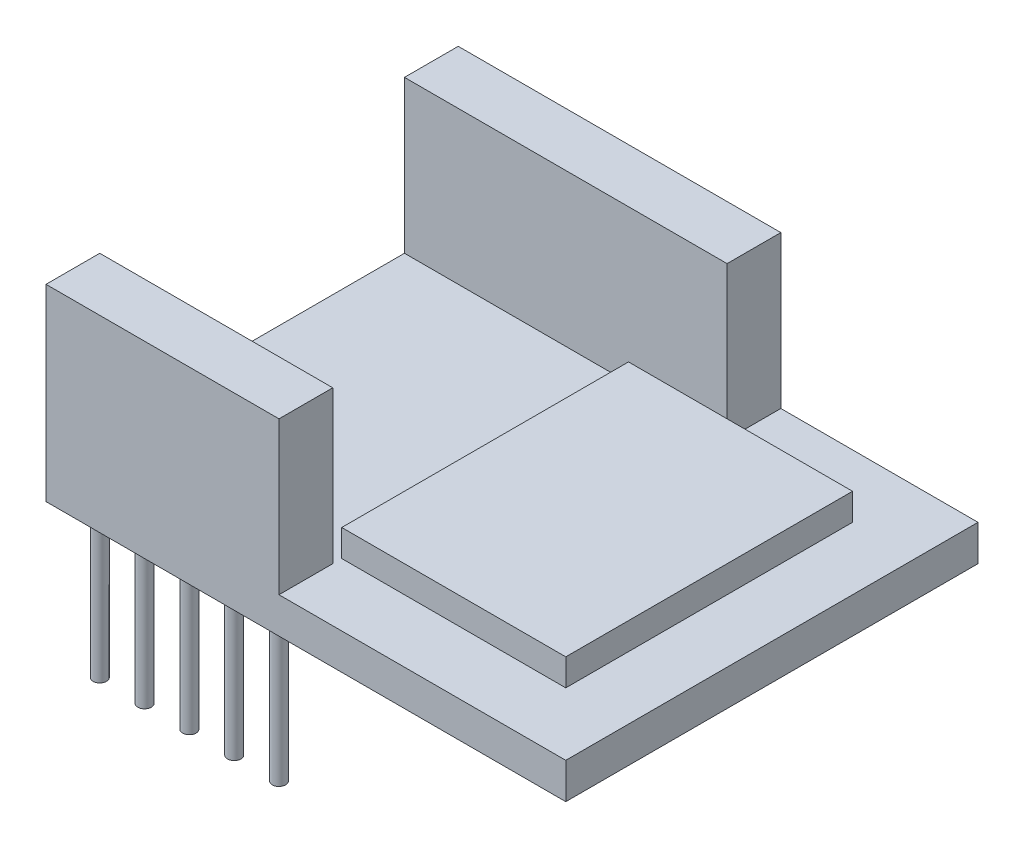
ISO-10303-21;
HEADER;
FILE_DESCRIPTION(('STEP AP214'),'2;1');
FILE_NAME('part.step','',(''),(''),'','','');
FILE_SCHEMA(('AUTOMOTIVE_DESIGN { 1 0 10303 214 1 1 1 1 }'));
ENDSEC;
DATA;
#1=APPLICATION_CONTEXT('core data for automotive mechanical design processes');
#2=APPLICATION_PROTOCOL_DEFINITION('international standard','automotive_design',2000,#1);
#3=PRODUCT_CONTEXT('',#1,'mechanical');
#4=PRODUCT('Part','Part','',(#3));
#5=PRODUCT_RELATED_PRODUCT_CATEGORY('part','',(#4));
#6=PRODUCT_DEFINITION_FORMATION('','',#4);
#7=PRODUCT_DEFINITION_CONTEXT('part definition',#1,'design');
#8=PRODUCT_DEFINITION('design','',#6,#7);
#9=PRODUCT_DEFINITION_SHAPE('','',#8);
#10=(LENGTH_UNIT() NAMED_UNIT(*) SI_UNIT(.MILLI.,.METRE.));
#11=(NAMED_UNIT(*) PLANE_ANGLE_UNIT() SI_UNIT($,.RADIAN.));
#12=(NAMED_UNIT(*) SI_UNIT($,.STERADIAN.) SOLID_ANGLE_UNIT());
#13=UNCERTAINTY_MEASURE_WITH_UNIT(LENGTH_MEASURE(1.E-05),#10,'distance_accuracy_value','');
#14=(GEOMETRIC_REPRESENTATION_CONTEXT(3) GLOBAL_UNCERTAINTY_ASSIGNED_CONTEXT((#13)) GLOBAL_UNIT_ASSIGNED_CONTEXT((#10,
#11,#12)) REPRESENTATION_CONTEXT('',''));
#15=CARTESIAN_POINT('',(0.,0.,0.));
#16=DIRECTION('',(0.,0.,1.));
#17=DIRECTION('',(1.,0.,0.));
#18=AXIS2_PLACEMENT_3D('',#15,#16,#17);
#19=CARTESIAN_POINT('',(0.,2.,0.));
#20=DIRECTION('',(0.,1.,0.));
#21=DIRECTION('',(0.,0.,1.));
#22=AXIS2_PLACEMENT_3D('',#19,#20,#21);
#23=PLANE('',#22);
#24=DIRECTION('',(0.,0.,-1.));
#25=VECTOR('',#24,1.);
#26=CARTESIAN_POINT('',(3.50000000000001,2.,-11.5));
#27=LINE('',#26,#25);
#28=CARTESIAN_POINT('',(3.50000000000002,2.,-8.49999999999999));
#29=VERTEX_POINT('',#28);
#30=CARTESIAN_POINT('',(3.50000000000001,2.,-11.5));
#31=VERTEX_POINT('',#30);
#32=EDGE_CURVE('E206',#29,#31,#27,.T.);
#33=ORIENTED_EDGE('',*,*,#32,.F.);
#34=DIRECTION('',(1.,0.,0.));
#35=VECTOR('',#34,1.);
#36=CARTESIAN_POINT('',(-14.5,2.,-8.49999999999999));
#37=LINE('',#36,#35);
#38=CARTESIAN_POINT('',(-14.5,2.,-8.49999999999999));
#39=VERTEX_POINT('',#38);
#40=EDGE_CURVE('E201',#39,#29,#37,.T.);
#41=ORIENTED_EDGE('',*,*,#40,.F.);
#42=DIRECTION('',(0.,0.,1.));
#43=VECTOR('',#42,1.);
#44=CARTESIAN_POINT('',(-14.5,2.,-11.5));
#45=LINE('',#44,#43);
#46=CARTESIAN_POINT('',(-14.5,2.,8.49999999999999));
#47=VERTEX_POINT('',#46);
#48=EDGE_CURVE('E246',#39,#47,#45,.T.);
#49=ORIENTED_EDGE('',*,*,#48,.T.);
#50=DIRECTION('',(-1.,0.,0.));
#51=VECTOR('',#50,1.);
#52=CARTESIAN_POINT('',(-14.5,2.,8.49999999999999));
#53=LINE('',#52,#51);
#54=CARTESIAN_POINT('',(-1.49999999999998,2.,8.49999999999999));
#55=VERTEX_POINT('',#54);
#56=EDGE_CURVE('E225',#55,#47,#53,.T.);
#57=ORIENTED_EDGE('',*,*,#56,.F.);
#58=DIRECTION('',(0.,0.,-1.));
#59=VECTOR('',#58,1.);
#60=CARTESIAN_POINT('',(-1.49999999999998,2.,11.5));
#61=LINE('',#60,#59);
#62=CARTESIAN_POINT('',(-1.49999999999998,2.,11.5));
#63=VERTEX_POINT('',#62);
#64=EDGE_CURVE('E220',#63,#55,#61,.T.);
#65=ORIENTED_EDGE('',*,*,#64,.F.);
#66=DIRECTION('',(1.,0.,0.));
#67=VECTOR('',#66,1.);
#68=CARTESIAN_POINT('',(-14.5,2.,11.5));
#69=LINE('',#68,#67);
#70=CARTESIAN_POINT('',(14.5,2.,11.5));
#71=VERTEX_POINT('',#70);
#72=EDGE_CURVE('E249',#63,#71,#69,.T.);
#73=ORIENTED_EDGE('',*,*,#72,.T.);
#74=DIRECTION('',(0.,0.,-1.));
#75=VECTOR('',#74,1.);
#76=CARTESIAN_POINT('',(14.5,2.,-11.5));
#77=LINE('',#76,#75);
#78=CARTESIAN_POINT('',(14.5,2.,-11.5));
#79=VERTEX_POINT('',#78);
#80=EDGE_CURVE('E302',#71,#79,#77,.T.);
#81=ORIENTED_EDGE('',*,*,#80,.T.);
#82=DIRECTION('',(-1.,0.,0.));
#83=VECTOR('',#82,1.);
#84=CARTESIAN_POINT('',(-14.5,2.,-11.5));
#85=LINE('',#84,#83);
#86=EDGE_CURVE('E250',#79,#31,#85,.T.);
#87=ORIENTED_EDGE('',*,*,#86,.T.);
#88=EDGE_LOOP('',(#33,#41,#49,#57,#65,#73,#81,#87));
#89=FACE_BOUND('',#88,.T.);
#90=DIRECTION('',(1.,0.,0.));
#91=VECTOR('',#90,1.);
#92=CARTESIAN_POINT('',(-1.49999999999998,2.,7.99999999999999));
#93=LINE('',#92,#91);
#94=CARTESIAN_POINT('',(-1.49999999999998,2.,7.99999999999999));
#95=VERTEX_POINT('',#94);
#96=CARTESIAN_POINT('',(11.,2.,7.99999999999999));
#97=VERTEX_POINT('',#96);
#98=EDGE_CURVE('E762',#95,#97,#93,.T.);
#99=ORIENTED_EDGE('',*,*,#98,.F.);
#100=DIRECTION('',(0.,0.,1.));
#101=VECTOR('',#100,1.);
#102=CARTESIAN_POINT('',(-1.49999999999998,2.,-8.00000000000001));
#103=LINE('',#102,#101);
#104=CARTESIAN_POINT('',(-1.49999999999998,2.,-8.00000000000001));
#105=VERTEX_POINT('',#104);
#106=EDGE_CURVE('E159',#105,#95,#103,.T.);
#107=ORIENTED_EDGE('',*,*,#106,.F.);
#108=DIRECTION('',(-1.,0.,0.));
#109=VECTOR('',#108,1.);
#110=CARTESIAN_POINT('',(11.,2.,-8.00000000000001));
#111=LINE('',#110,#109);
#112=CARTESIAN_POINT('',(11.,2.,-8.00000000000001));
#113=VERTEX_POINT('',#112);
#114=EDGE_CURVE('E155',#113,#105,#111,.T.);
#115=ORIENTED_EDGE('',*,*,#114,.F.);
#116=DIRECTION('',(0.,0.,-1.));
#117=VECTOR('',#116,1.);
#118=CARTESIAN_POINT('',(11.,2.,7.99999999999999));
#119=LINE('',#118,#117);
#120=EDGE_CURVE('E759',#97,#113,#119,.T.);
#121=ORIENTED_EDGE('',*,*,#120,.F.);
#122=EDGE_LOOP('',(#99,#107,#115,#121));
#123=FACE_BOUND('',#122,.T.);
#124=ADVANCED_FACE('F34',(#89,#123),#23,.T.);
#125=CARTESIAN_POINT('',(0.,0.,0.));
#126=DIRECTION('',(0.,1.,0.));
#127=DIRECTION('',(0.,0.,1.));
#128=AXIS2_PLACEMENT_3D('',#125,#126,#127);
#129=PLANE('',#128);
#130=CARTESIAN_POINT('',(-10.5,0.,-10.));
#131=DIRECTION('',(0.,1.,0.));
#132=DIRECTION('',(0.,0.,1.));
#133=AXIS2_PLACEMENT_3D('',#130,#131,#132);
#134=CIRCLE('',#133,0.374999999999999);
#135=CARTESIAN_POINT('',(-10.5,0.,-9.62500000000001));
#136=VERTEX_POINT('',#135);
#137=EDGE_CURVE('E42',#136,#136,#134,.F.);
#138=ORIENTED_EDGE('',*,*,#137,.F.);
#139=EDGE_LOOP('',(#138));
#140=FACE_BOUND('',#139,.T.);
#141=CARTESIAN_POINT('',(-10.5,0.,9.99999999999999));
#142=DIRECTION('',(0.,1.,0.));
#143=DIRECTION('',(0.,0.,1.));
#144=AXIS2_PLACEMENT_3D('',#141,#142,#143);
#145=CIRCLE('',#144,0.374999999999999);
#146=CARTESIAN_POINT('',(-10.5,0.,10.375));
#147=VERTEX_POINT('',#146);
#148=EDGE_CURVE('E341',#147,#147,#145,.F.);
#149=ORIENTED_EDGE('',*,*,#148,.F.);
#150=EDGE_LOOP('',(#149));
#151=FACE_BOUND('',#150,.T.);
#152=CARTESIAN_POINT('',(-5.49999999999999,0.,9.99999999999999));
#153=DIRECTION('',(0.,1.,0.));
#154=DIRECTION('',(0.,0.,1.));
#155=AXIS2_PLACEMENT_3D('',#152,#153,#154);
#156=CIRCLE('',#155,0.375000000000001);
#157=CARTESIAN_POINT('',(-5.49999999999999,0.,10.375));
#158=VERTEX_POINT('',#157);
#159=EDGE_CURVE('E335',#158,#158,#156,.F.);
#160=ORIENTED_EDGE('',*,*,#159,.F.);
#161=EDGE_LOOP('',(#160));
#162=FACE_BOUND('',#161,.T.);
#163=CARTESIAN_POINT('',(-7.99999999999999,0.,-10.));
#164=DIRECTION('',(0.,1.,0.));
#165=DIRECTION('',(0.,0.,1.));
#166=AXIS2_PLACEMENT_3D('',#163,#164,#165);
#167=CIRCLE('',#166,0.374999999999999);
#168=CARTESIAN_POINT('',(-7.99999999999999,0.,-9.62500000000001));
#169=VERTEX_POINT('',#168);
#170=EDGE_CURVE('E329',#169,#169,#167,.F.);
#171=ORIENTED_EDGE('',*,*,#170,.F.);
#172=EDGE_LOOP('',(#171));
#173=FACE_BOUND('',#172,.T.);
#174=CARTESIAN_POINT('',(-2.99999999999999,0.,-10.));
#175=DIRECTION('',(0.,1.,0.));
#176=DIRECTION('',(0.,0.,1.));
#177=AXIS2_PLACEMENT_3D('',#174,#175,#176);
#178=CIRCLE('',#177,0.375000000000001);
#179=CARTESIAN_POINT('',(-2.99999999999999,0.,-9.62500000000001));
#180=VERTEX_POINT('',#179);
#181=EDGE_CURVE('E320',#180,#180,#178,.F.);
#182=ORIENTED_EDGE('',*,*,#181,.F.);
#183=EDGE_LOOP('',(#182));
#184=FACE_BOUND('',#183,.T.);
#185=CARTESIAN_POINT('',(2.00000000000001,0.,-10.));
#186=DIRECTION('',(0.,1.,0.));
#187=DIRECTION('',(0.,0.,1.));
#188=AXIS2_PLACEMENT_3D('',#185,#186,#187);
#189=CIRCLE('',#188,0.375000000000001);
#190=CARTESIAN_POINT('',(2.00000000000001,0.,-9.62500000000001));
#191=VERTEX_POINT('',#190);
#192=EDGE_CURVE('E251',#191,#191,#189,.F.);
#193=ORIENTED_EDGE('',*,*,#192,.F.);
#194=EDGE_LOOP('',(#193));
#195=FACE_BOUND('',#194,.T.);
#196=DIRECTION('',(0.,0.,-1.));
#197=VECTOR('',#196,1.);
#198=CARTESIAN_POINT('',(14.5,0.,-11.5));
#199=LINE('',#198,#197);
#200=CARTESIAN_POINT('',(14.5,0.,11.5));
#201=VERTEX_POINT('',#200);
#202=CARTESIAN_POINT('',(14.5,0.,-11.5));
#203=VERTEX_POINT('',#202);
#204=EDGE_CURVE('E258',#201,#203,#199,.T.);
#205=ORIENTED_EDGE('',*,*,#204,.F.);
#206=DIRECTION('',(1.,0.,0.));
#207=VECTOR('',#206,1.);
#208=CARTESIAN_POINT('',(-14.5,0.,11.5));
#209=LINE('',#208,#207);
#210=CARTESIAN_POINT('',(-14.5,0.,11.5));
#211=VERTEX_POINT('',#210);
#212=EDGE_CURVE('E296',#211,#201,#209,.T.);
#213=ORIENTED_EDGE('',*,*,#212,.F.);
#214=DIRECTION('',(0.,0.,1.));
#215=VECTOR('',#214,1.);
#216=CARTESIAN_POINT('',(-14.5,0.,-11.5));
#217=LINE('',#216,#215);
#218=CARTESIAN_POINT('',(-14.5,0.,-11.5));
#219=VERTEX_POINT('',#218);
#220=EDGE_CURVE('E305',#219,#211,#217,.T.);
#221=ORIENTED_EDGE('',*,*,#220,.F.);
#222=DIRECTION('',(-1.,0.,0.));
#223=VECTOR('',#222,1.);
#224=CARTESIAN_POINT('',(-14.5,0.,-11.5));
#225=LINE('',#224,#223);
#226=EDGE_CURVE('E275',#203,#219,#225,.T.);
#227=ORIENTED_EDGE('',*,*,#226,.F.);
#228=EDGE_LOOP('',(#205,#213,#221,#227));
#229=FACE_BOUND('',#228,.T.);
#230=CARTESIAN_POINT('',(-0.499999999999992,0.,-10.));
#231=DIRECTION('',(0.,1.,0.));
#232=DIRECTION('',(0.,0.,1.));
#233=AXIS2_PLACEMENT_3D('',#230,#231,#232);
#234=CIRCLE('',#233,0.375000000000001);
#235=CARTESIAN_POINT('',(-0.499999999999992,0.,-9.62500000000001));
#236=VERTEX_POINT('',#235);
#237=EDGE_CURVE('E316',#236,#236,#234,.F.);
#238=ORIENTED_EDGE('',*,*,#237,.F.);
#239=EDGE_LOOP('',(#238));
#240=FACE_BOUND('',#239,.T.);
#241=CARTESIAN_POINT('',(-5.49999999999999,0.,-10.));
#242=DIRECTION('',(0.,1.,0.));
#243=DIRECTION('',(0.,0.,1.));
#244=AXIS2_PLACEMENT_3D('',#241,#242,#243);
#245=CIRCLE('',#244,0.375000000000001);
#246=CARTESIAN_POINT('',(-5.49999999999999,0.,-9.62500000000001));
#247=VERTEX_POINT('',#246);
#248=EDGE_CURVE('E324',#247,#247,#245,.F.);
#249=ORIENTED_EDGE('',*,*,#248,.F.);
#250=EDGE_LOOP('',(#249));
#251=FACE_BOUND('',#250,.T.);
#252=CARTESIAN_POINT('',(-3.,0.,9.99999999999999));
#253=DIRECTION('',(0.,1.,0.));
#254=DIRECTION('',(0.,0.,1.));
#255=AXIS2_PLACEMENT_3D('',#252,#253,#254);
#256=CIRCLE('',#255,0.375000000000001);
#257=CARTESIAN_POINT('',(-3.,0.,10.375));
#258=VERTEX_POINT('',#257);
#259=EDGE_CURVE('E332',#258,#258,#256,.F.);
#260=ORIENTED_EDGE('',*,*,#259,.F.);
#261=EDGE_LOOP('',(#260));
#262=FACE_BOUND('',#261,.T.);
#263=CARTESIAN_POINT('',(-7.99999999999999,0.,9.99999999999999));
#264=DIRECTION('',(0.,1.,0.));
#265=DIRECTION('',(0.,0.,1.));
#266=AXIS2_PLACEMENT_3D('',#263,#264,#265);
#267=CIRCLE('',#266,0.374999999999999);
#268=CARTESIAN_POINT('',(-7.99999999999999,0.,10.375));
#269=VERTEX_POINT('',#268);
#270=EDGE_CURVE('E338',#269,#269,#267,.F.);
#271=ORIENTED_EDGE('',*,*,#270,.F.);
#272=EDGE_LOOP('',(#271));
#273=FACE_BOUND('',#272,.T.);
#274=CARTESIAN_POINT('',(-13.,0.,9.99999999999999));
#275=DIRECTION('',(0.,1.,0.));
#276=DIRECTION('',(0.,0.,1.));
#277=AXIS2_PLACEMENT_3D('',#274,#275,#276);
#278=CIRCLE('',#277,0.375000000000003);
#279=CARTESIAN_POINT('',(-13.,0.,10.375));
#280=VERTEX_POINT('',#279);
#281=EDGE_CURVE('E344',#280,#280,#278,.F.);
#282=ORIENTED_EDGE('',*,*,#281,.F.);
#283=EDGE_LOOP('',(#282));
#284=FACE_BOUND('',#283,.T.);
#285=CARTESIAN_POINT('',(-13.,0.,-10.));
#286=DIRECTION('',(0.,1.,0.));
#287=DIRECTION('',(0.,0.,1.));
#288=AXIS2_PLACEMENT_3D('',#285,#286,#287);
#289=CIRCLE('',#288,0.375000000000003);
#290=CARTESIAN_POINT('',(-13.,0.,-9.62500000000001));
#291=VERTEX_POINT('',#290);
#292=EDGE_CURVE('E11',#291,#291,#289,.F.);
#293=ORIENTED_EDGE('',*,*,#292,.F.);
#294=EDGE_LOOP('',(#293));
#295=FACE_BOUND('',#294,.T.);
#296=ADVANCED_FACE('F351',(#140,#151,#162,#173,#184,#195,#229,#240,#251,#262,#273,#284,#295),
#129,.F.);
#297=CARTESIAN_POINT('',(14.5,2.,-11.5));
#298=DIRECTION('',(-1.,0.,0.));
#299=DIRECTION('',(0.,0.,1.));
#300=AXIS2_PLACEMENT_3D('',#297,#298,#299);
#301=PLANE('',#300);
#302=ORIENTED_EDGE('',*,*,#204,.T.);
#303=DIRECTION('',(0.,-1.,0.));
#304=VECTOR('',#303,1.);
#305=CARTESIAN_POINT('',(14.5,2.,-11.5));
#306=LINE('',#305,#304);
#307=EDGE_CURVE('E264',#79,#203,#306,.T.);
#308=ORIENTED_EDGE('',*,*,#307,.F.);
#309=ORIENTED_EDGE('',*,*,#80,.F.);
#310=DIRECTION('',(0.,-1.,0.));
#311=VECTOR('',#310,1.);
#312=CARTESIAN_POINT('',(14.5,2.,11.5));
#313=LINE('',#312,#311);
#314=EDGE_CURVE('E263',#71,#201,#313,.T.);
#315=ORIENTED_EDGE('',*,*,#314,.T.);
#316=EDGE_LOOP('',(#302,#308,#309,#315));
#317=FACE_BOUND('',#316,.T.);
#318=ADVANCED_FACE('F36',(#317),#301,.F.);
#319=CARTESIAN_POINT('',(-14.5,2.,-11.5));
#320=DIRECTION('',(0.,0.,1.));
#321=DIRECTION('',(1.,0.,0.));
#322=AXIS2_PLACEMENT_3D('',#319,#320,#321);
#323=PLANE('',#322);
#324=ORIENTED_EDGE('',*,*,#226,.T.);
#325=DIRECTION('',(0.,-1.,0.));
#326=VECTOR('',#325,1.);
#327=CARTESIAN_POINT('',(-14.5,2.,-11.5));
#328=LINE('',#327,#326);
#329=CARTESIAN_POINT('',(-14.5,10.5,-11.5));
#330=VERTEX_POINT('',#329);
#331=EDGE_CURVE('E309',#330,#219,#328,.T.);
#332=ORIENTED_EDGE('',*,*,#331,.F.);
#333=DIRECTION('',(-1.,0.,0.));
#334=VECTOR('',#333,1.);
#335=CARTESIAN_POINT('',(-14.5,10.5,-11.5));
#336=LINE('',#335,#334);
#337=CARTESIAN_POINT('',(3.50000000000001,10.5,-11.5));
#338=VERTEX_POINT('',#337);
#339=EDGE_CURVE('E202',#338,#330,#336,.T.);
#340=ORIENTED_EDGE('',*,*,#339,.F.);
#341=DIRECTION('',(0.,-1.,0.));
#342=VECTOR('',#341,1.);
#343=CARTESIAN_POINT('',(3.50000000000001,10.5,-11.5));
#344=LINE('',#343,#342);
#345=EDGE_CURVE('E212',#338,#31,#344,.T.);
#346=ORIENTED_EDGE('',*,*,#345,.T.);
#347=ORIENTED_EDGE('',*,*,#86,.F.);
#348=ORIENTED_EDGE('',*,*,#307,.T.);
#349=EDGE_LOOP('',(#324,#332,#340,#346,#347,#348));
#350=FACE_BOUND('',#349,.T.);
#351=ADVANCED_FACE('F402',(#350),#323,.F.);
#352=CARTESIAN_POINT('',(-14.5,2.,-11.5));
#353=DIRECTION('',(1.,0.,0.));
#354=DIRECTION('',(0.,0.,-1.));
#355=AXIS2_PLACEMENT_3D('',#352,#353,#354);
#356=PLANE('',#355);
#357=ORIENTED_EDGE('',*,*,#220,.T.);
#358=DIRECTION('',(0.,-1.,0.));
#359=VECTOR('',#358,1.);
#360=CARTESIAN_POINT('',(-14.5,2.,11.5));
#361=LINE('',#360,#359);
#362=CARTESIAN_POINT('',(-14.5,10.5,11.5));
#363=VERTEX_POINT('',#362);
#364=EDGE_CURVE('E299',#363,#211,#361,.T.);
#365=ORIENTED_EDGE('',*,*,#364,.F.);
#366=DIRECTION('',(0.,0.,1.));
#367=VECTOR('',#366,1.);
#368=CARTESIAN_POINT('',(-14.5,10.5,11.5));
#369=LINE('',#368,#367);
#370=CARTESIAN_POINT('',(-14.5,10.5,8.49999999999999));
#371=VERTEX_POINT('',#370);
#372=EDGE_CURVE('E221',#371,#363,#369,.T.);
#373=ORIENTED_EDGE('',*,*,#372,.F.);
#374=DIRECTION('',(0.,-1.,0.));
#375=VECTOR('',#374,1.);
#376=CARTESIAN_POINT('',(-14.5,10.5,8.49999999999999));
#377=LINE('',#376,#375);
#378=EDGE_CURVE('E231',#371,#47,#377,.T.);
#379=ORIENTED_EDGE('',*,*,#378,.T.);
#380=ORIENTED_EDGE('',*,*,#48,.F.);
#381=DIRECTION('',(0.,-1.,0.));
#382=VECTOR('',#381,1.);
#383=CARTESIAN_POINT('',(-14.5,10.5,-8.49999999999999));
#384=LINE('',#383,#382);
#385=CARTESIAN_POINT('',(-14.5,10.5,-8.49999999999999));
#386=VERTEX_POINT('',#385);
#387=EDGE_CURVE('E218',#386,#39,#384,.T.);
#388=ORIENTED_EDGE('',*,*,#387,.F.);
#389=DIRECTION('',(0.,0.,1.));
#390=VECTOR('',#389,1.);
#391=CARTESIAN_POINT('',(-14.5,10.5,-11.5));
#392=LINE('',#391,#390);
#393=EDGE_CURVE('E205',#330,#386,#392,.T.);
#394=ORIENTED_EDGE('',*,*,#393,.F.);
#395=ORIENTED_EDGE('',*,*,#331,.T.);
#396=EDGE_LOOP('',(#357,#365,#373,#379,#380,#388,#394,#395));
#397=FACE_BOUND('',#396,.T.);
#398=ADVANCED_FACE('F400',(#397),#356,.F.);
#399=CARTESIAN_POINT('',(-14.5,2.,11.5));
#400=DIRECTION('',(0.,0.,-1.));
#401=DIRECTION('',(-1.,0.,0.));
#402=AXIS2_PLACEMENT_3D('',#399,#400,#401);
#403=PLANE('',#402);
#404=ORIENTED_EDGE('',*,*,#212,.T.);
#405=ORIENTED_EDGE('',*,*,#314,.F.);
#406=ORIENTED_EDGE('',*,*,#72,.F.);
#407=DIRECTION('',(0.,-1.,0.));
#408=VECTOR('',#407,1.);
#409=CARTESIAN_POINT('',(-1.49999999999998,10.5,11.5));
#410=LINE('',#409,#408);
#411=CARTESIAN_POINT('',(-1.49999999999998,10.5,11.5));
#412=VERTEX_POINT('',#411);
#413=EDGE_CURVE('E269',#412,#63,#410,.T.);
#414=ORIENTED_EDGE('',*,*,#413,.F.);
#415=DIRECTION('',(1.,0.,0.));
#416=VECTOR('',#415,1.);
#417=CARTESIAN_POINT('',(-14.5,10.5,11.5));
#418=LINE('',#417,#416);
#419=EDGE_CURVE('E224',#363,#412,#418,.T.);
#420=ORIENTED_EDGE('',*,*,#419,.F.);
#421=ORIENTED_EDGE('',*,*,#364,.T.);
#422=EDGE_LOOP('',(#404,#405,#406,#414,#420,#421));
#423=FACE_BOUND('',#422,.T.);
#424=ADVANCED_FACE('F290',(#423),#403,.F.);
#425=CARTESIAN_POINT('',(-1.49999999999998,10.5,11.5));
#426=DIRECTION('',(-1.,0.,0.));
#427=DIRECTION('',(0.,0.,1.));
#428=AXIS2_PLACEMENT_3D('',#425,#426,#427);
#429=PLANE('',#428);
#430=ORIENTED_EDGE('',*,*,#64,.T.);
#431=DIRECTION('',(0.,-1.,0.));
#432=VECTOR('',#431,1.);
#433=CARTESIAN_POINT('',(-1.49999999999998,10.5,8.49999999999999));
#434=LINE('',#433,#432);
#435=CARTESIAN_POINT('',(-1.49999999999998,10.5,8.49999999999999));
#436=VERTEX_POINT('',#435);
#437=EDGE_CURVE('E234',#436,#55,#434,.T.);
#438=ORIENTED_EDGE('',*,*,#437,.F.);
#439=DIRECTION('',(0.,0.,-1.));
#440=VECTOR('',#439,1.);
#441=CARTESIAN_POINT('',(-1.49999999999998,10.5,11.5));
#442=LINE('',#441,#440);
#443=EDGE_CURVE('E227',#412,#436,#442,.T.);
#444=ORIENTED_EDGE('',*,*,#443,.F.);
#445=ORIENTED_EDGE('',*,*,#413,.T.);
#446=EDGE_LOOP('',(#430,#438,#444,#445));
#447=FACE_BOUND('',#446,.T.);
#448=ADVANCED_FACE('F282',(#447),#429,.F.);
#449=CARTESIAN_POINT('',(-14.5,10.5,8.49999999999999));
#450=DIRECTION('',(0.,0.,1.));
#451=DIRECTION('',(1.,0.,0.));
#452=AXIS2_PLACEMENT_3D('',#449,#450,#451);
#453=PLANE('',#452);
#454=ORIENTED_EDGE('',*,*,#56,.T.);
#455=ORIENTED_EDGE('',*,*,#378,.F.);
#456=DIRECTION('',(-1.,0.,0.));
#457=VECTOR('',#456,1.);
#458=CARTESIAN_POINT('',(-14.5,10.5,8.49999999999999));
#459=LINE('',#458,#457);
#460=EDGE_CURVE('E229',#436,#371,#459,.T.);
#461=ORIENTED_EDGE('',*,*,#460,.F.);
#462=ORIENTED_EDGE('',*,*,#437,.T.);
#463=EDGE_LOOP('',(#454,#455,#461,#462));
#464=FACE_BOUND('',#463,.T.);
#465=ADVANCED_FACE('F280',(#464),#453,.F.);
#466=CARTESIAN_POINT('',(0.,10.5,0.));
#467=DIRECTION('',(0.,-1.,0.));
#468=DIRECTION('',(0.,0.,-1.));
#469=AXIS2_PLACEMENT_3D('',#466,#467,#468);
#470=PLANE('',#469);
#471=ORIENTED_EDGE('',*,*,#372,.T.);
#472=ORIENTED_EDGE('',*,*,#419,.T.);
#473=ORIENTED_EDGE('',*,*,#443,.T.);
#474=ORIENTED_EDGE('',*,*,#460,.T.);
#475=EDGE_LOOP('',(#471,#472,#473,#474));
#476=FACE_BOUND('',#475,.T.);
#477=ADVANCED_FACE('F410',(#476),#470,.F.);
#478=CARTESIAN_POINT('',(-14.5,10.5,-8.49999999999999));
#479=DIRECTION('',(0.,0.,-1.));
#480=DIRECTION('',(-1.,0.,0.));
#481=AXIS2_PLACEMENT_3D('',#478,#479,#480);
#482=PLANE('',#481);
#483=ORIENTED_EDGE('',*,*,#40,.T.);
#484=DIRECTION('',(0.,-1.,0.));
#485=VECTOR('',#484,1.);
#486=CARTESIAN_POINT('',(3.50000000000002,10.5,-8.49999999999999));
#487=LINE('',#486,#485);
#488=CARTESIAN_POINT('',(3.50000000000002,10.5,-8.49999999999999));
#489=VERTEX_POINT('',#488);
#490=EDGE_CURVE('E57',#489,#29,#487,.T.);
#491=ORIENTED_EDGE('',*,*,#490,.F.);
#492=DIRECTION('',(1.,0.,0.));
#493=VECTOR('',#492,1.);
#494=CARTESIAN_POINT('',(-14.5,10.5,-8.49999999999999));
#495=LINE('',#494,#493);
#496=EDGE_CURVE('E208',#386,#489,#495,.T.);
#497=ORIENTED_EDGE('',*,*,#496,.F.);
#498=ORIENTED_EDGE('',*,*,#387,.T.);
#499=EDGE_LOOP('',(#483,#491,#497,#498));
#500=FACE_BOUND('',#499,.T.);
#501=ADVANCED_FACE('F416',(#500),#482,.F.);
#502=CARTESIAN_POINT('',(3.50000000000001,10.5,-11.5));
#503=DIRECTION('',(-1.,0.,0.));
#504=DIRECTION('',(0.,0.,1.));
#505=AXIS2_PLACEMENT_3D('',#502,#503,#504);
#506=PLANE('',#505);
#507=ORIENTED_EDGE('',*,*,#32,.T.);
#508=ORIENTED_EDGE('',*,*,#345,.F.);
#509=DIRECTION('',(0.,0.,-1.));
#510=VECTOR('',#509,1.);
#511=CARTESIAN_POINT('',(3.50000000000001,10.5,-11.5));
#512=LINE('',#511,#510);
#513=EDGE_CURVE('E210',#489,#338,#512,.T.);
#514=ORIENTED_EDGE('',*,*,#513,.F.);
#515=ORIENTED_EDGE('',*,*,#490,.T.);
#516=EDGE_LOOP('',(#507,#508,#514,#515));
#517=FACE_BOUND('',#516,.T.);
#518=ADVANCED_FACE('F420',(#517),#506,.F.);
#519=CARTESIAN_POINT('',(0.,10.5,0.));
#520=DIRECTION('',(0.,-1.,0.));
#521=DIRECTION('',(0.,0.,-1.));
#522=AXIS2_PLACEMENT_3D('',#519,#520,#521);
#523=PLANE('',#522);
#524=ORIENTED_EDGE('',*,*,#339,.T.);
#525=ORIENTED_EDGE('',*,*,#393,.T.);
#526=ORIENTED_EDGE('',*,*,#496,.T.);
#527=ORIENTED_EDGE('',*,*,#513,.T.);
#528=EDGE_LOOP('',(#524,#525,#526,#527));
#529=FACE_BOUND('',#528,.T.);
#530=ADVANCED_FACE('F418',(#529),#523,.F.);
#531=CARTESIAN_POINT('',(2.00000000000001,-8.5,-10.));
#532=DIRECTION('',(0.,1.,0.));
#533=DIRECTION('',(0.,0.,1.));
#534=AXIS2_PLACEMENT_3D('',#531,#532,#533);
#535=CYLINDRICAL_SURFACE('',#534,0.375000000000001);
#536=CARTESIAN_POINT('',(2.00000000000001,-8.5,-10.));
#537=DIRECTION('',(0.,-1.,0.));
#538=DIRECTION('',(0.,0.,-1.));
#539=AXIS2_PLACEMENT_3D('',#536,#537,#538);
#540=CIRCLE('',#539,0.375000000000001);
#541=CARTESIAN_POINT('',(2.00000000000001,-8.5,-10.375));
#542=VERTEX_POINT('',#541);
#543=EDGE_CURVE('E198',#542,#542,#540,.T.);
#544=ORIENTED_EDGE('',*,*,#543,.F.);
#545=EDGE_LOOP('',(#544));
#546=FACE_BOUND('',#545,.T.);
#547=ORIENTED_EDGE('',*,*,#192,.T.);
#548=EDGE_LOOP('',(#547));
#549=FACE_BOUND('',#548,.T.);
#550=ADVANCED_FACE('F427',(#546,#549),#535,.T.);
#551=CARTESIAN_POINT('',(2.00000000000001,-8.5,-10.));
#552=DIRECTION('',(0.,-1.,0.));
#553=DIRECTION('',(0.,0.,-1.));
#554=AXIS2_PLACEMENT_3D('',#551,#552,#553);
#555=PLANE('',#554);
#556=ORIENTED_EDGE('',*,*,#543,.T.);
#557=EDGE_LOOP('',(#556));
#558=FACE_BOUND('',#557,.T.);
#559=ADVANCED_FACE('F479',(#558),#555,.T.);
#560=CARTESIAN_POINT('',(-0.499999999999992,-8.5,-10.));
#561=DIRECTION('',(0.,1.,0.));
#562=DIRECTION('',(0.,0.,1.));
#563=AXIS2_PLACEMENT_3D('',#560,#561,#562);
#564=CYLINDRICAL_SURFACE('',#563,0.375000000000001);
#565=CARTESIAN_POINT('',(-0.499999999999992,-8.5,-10.));
#566=DIRECTION('',(0.,-1.,0.));
#567=DIRECTION('',(0.,0.,-1.));
#568=AXIS2_PLACEMENT_3D('',#565,#566,#567);
#569=CIRCLE('',#568,0.375000000000001);
#570=CARTESIAN_POINT('',(-0.499999999999992,-8.5,-10.375));
#571=VERTEX_POINT('',#570);
#572=EDGE_CURVE('E195',#571,#571,#569,.T.);
#573=ORIENTED_EDGE('',*,*,#572,.F.);
#574=EDGE_LOOP('',(#573));
#575=FACE_BOUND('',#574,.T.);
#576=ORIENTED_EDGE('',*,*,#237,.T.);
#577=EDGE_LOOP('',(#576));
#578=FACE_BOUND('',#577,.T.);
#579=ADVANCED_FACE('F490',(#575,#578),#564,.T.);
#580=CARTESIAN_POINT('',(-0.499999999999992,-8.5,-10.));
#581=DIRECTION('',(0.,-1.,0.));
#582=DIRECTION('',(0.,0.,-1.));
#583=AXIS2_PLACEMENT_3D('',#580,#581,#582);
#584=PLANE('',#583);
#585=ORIENTED_EDGE('',*,*,#572,.T.);
#586=EDGE_LOOP('',(#585));
#587=FACE_BOUND('',#586,.T.);
#588=ADVANCED_FACE('F500',(#587),#584,.T.);
#589=CARTESIAN_POINT('',(-2.99999999999999,-8.5,-10.));
#590=DIRECTION('',(0.,1.,0.));
#591=DIRECTION('',(0.,0.,1.));
#592=AXIS2_PLACEMENT_3D('',#589,#590,#591);
#593=CYLINDRICAL_SURFACE('',#592,0.375000000000001);
#594=CARTESIAN_POINT('',(-2.99999999999999,-8.5,-10.));
#595=DIRECTION('',(0.,-1.,0.));
#596=DIRECTION('',(0.,0.,-1.));
#597=AXIS2_PLACEMENT_3D('',#594,#595,#596);
#598=CIRCLE('',#597,0.375000000000001);
#599=CARTESIAN_POINT('',(-2.99999999999999,-8.5,-10.375));
#600=VERTEX_POINT('',#599);
#601=EDGE_CURVE('E192',#600,#600,#598,.T.);
#602=ORIENTED_EDGE('',*,*,#601,.F.);
#603=EDGE_LOOP('',(#602));
#604=FACE_BOUND('',#603,.T.);
#605=ORIENTED_EDGE('',*,*,#181,.T.);
#606=EDGE_LOOP('',(#605));
#607=FACE_BOUND('',#606,.T.);
#608=ADVANCED_FACE('F511',(#604,#607),#593,.T.);
#609=CARTESIAN_POINT('',(-2.99999999999999,-8.5,-10.));
#610=DIRECTION('',(0.,-1.,0.));
#611=DIRECTION('',(0.,0.,-1.));
#612=AXIS2_PLACEMENT_3D('',#609,#610,#611);
#613=PLANE('',#612);
#614=ORIENTED_EDGE('',*,*,#601,.T.);
#615=EDGE_LOOP('',(#614));
#616=FACE_BOUND('',#615,.T.);
#617=ADVANCED_FACE('F521',(#616),#613,.T.);
#618=CARTESIAN_POINT('',(-5.49999999999999,-8.5,-10.));
#619=DIRECTION('',(0.,1.,0.));
#620=DIRECTION('',(0.,0.,1.));
#621=AXIS2_PLACEMENT_3D('',#618,#619,#620);
#622=CYLINDRICAL_SURFACE('',#621,0.375000000000001);
#623=CARTESIAN_POINT('',(-5.49999999999999,-8.5,-10.));
#624=DIRECTION('',(0.,-1.,0.));
#625=DIRECTION('',(0.,0.,-1.));
#626=AXIS2_PLACEMENT_3D('',#623,#624,#625);
#627=CIRCLE('',#626,0.375000000000001);
#628=CARTESIAN_POINT('',(-5.49999999999999,-8.5,-10.375));
#629=VERTEX_POINT('',#628);
#630=EDGE_CURVE('E189',#629,#629,#627,.T.);
#631=ORIENTED_EDGE('',*,*,#630,.F.);
#632=EDGE_LOOP('',(#631));
#633=FACE_BOUND('',#632,.T.);
#634=ORIENTED_EDGE('',*,*,#248,.T.);
#635=EDGE_LOOP('',(#634));
#636=FACE_BOUND('',#635,.T.);
#637=ADVANCED_FACE('F532',(#633,#636),#622,.T.);
#638=CARTESIAN_POINT('',(-5.49999999999999,-8.5,-10.));
#639=DIRECTION('',(0.,-1.,0.));
#640=DIRECTION('',(0.,0.,-1.));
#641=AXIS2_PLACEMENT_3D('',#638,#639,#640);
#642=PLANE('',#641);
#643=ORIENTED_EDGE('',*,*,#630,.T.);
#644=EDGE_LOOP('',(#643));
#645=FACE_BOUND('',#644,.T.);
#646=ADVANCED_FACE('F542',(#645),#642,.T.);
#647=CARTESIAN_POINT('',(-7.99999999999999,-8.5,-10.));
#648=DIRECTION('',(0.,1.,0.));
#649=DIRECTION('',(0.,0.,1.));
#650=AXIS2_PLACEMENT_3D('',#647,#648,#649);
#651=CYLINDRICAL_SURFACE('',#650,0.374999999999999);
#652=CARTESIAN_POINT('',(-7.99999999999999,-8.5,-10.));
#653=DIRECTION('',(0.,-1.,0.));
#654=DIRECTION('',(0.,0.,-1.));
#655=AXIS2_PLACEMENT_3D('',#652,#653,#654);
#656=CIRCLE('',#655,0.374999999999999);
#657=CARTESIAN_POINT('',(-7.99999999999999,-8.5,-10.375));
#658=VERTEX_POINT('',#657);
#659=EDGE_CURVE('E186',#658,#658,#656,.T.);
#660=ORIENTED_EDGE('',*,*,#659,.F.);
#661=EDGE_LOOP('',(#660));
#662=FACE_BOUND('',#661,.T.);
#663=ORIENTED_EDGE('',*,*,#170,.T.);
#664=EDGE_LOOP('',(#663));
#665=FACE_BOUND('',#664,.T.);
#666=ADVANCED_FACE('F553',(#662,#665),#651,.T.);
#667=CARTESIAN_POINT('',(-7.99999999999999,-8.5,-10.));
#668=DIRECTION('',(0.,-1.,0.));
#669=DIRECTION('',(0.,0.,-1.));
#670=AXIS2_PLACEMENT_3D('',#667,#668,#669);
#671=PLANE('',#670);
#672=ORIENTED_EDGE('',*,*,#659,.T.);
#673=EDGE_LOOP('',(#672));
#674=FACE_BOUND('',#673,.T.);
#675=ADVANCED_FACE('F563',(#674),#671,.T.);
#676=CARTESIAN_POINT('',(-3.,-8.5,9.99999999999999));
#677=DIRECTION('',(0.,1.,0.));
#678=DIRECTION('',(0.,0.,1.));
#679=AXIS2_PLACEMENT_3D('',#676,#677,#678);
#680=CYLINDRICAL_SURFACE('',#679,0.375000000000001);
#681=CARTESIAN_POINT('',(-3.,-8.5,9.99999999999999));
#682=DIRECTION('',(0.,-1.,0.));
#683=DIRECTION('',(0.,0.,1.));
#684=AXIS2_PLACEMENT_3D('',#681,#682,#683);
#685=CIRCLE('',#684,0.375000000000001);
#686=CARTESIAN_POINT('',(-3.,-8.5,10.375));
#687=VERTEX_POINT('',#686);
#688=EDGE_CURVE('E183',#687,#687,#685,.T.);
#689=ORIENTED_EDGE('',*,*,#688,.F.);
#690=EDGE_LOOP('',(#689));
#691=FACE_BOUND('',#690,.T.);
#692=ORIENTED_EDGE('',*,*,#259,.T.);
#693=EDGE_LOOP('',(#692));
#694=FACE_BOUND('',#693,.T.);
#695=ADVANCED_FACE('F574',(#691,#694),#680,.T.);
#696=CARTESIAN_POINT('',(-3.,-8.5,9.99999999999999));
#697=DIRECTION('',(0.,1.,0.));
#698=DIRECTION('',(0.,0.,1.));
#699=AXIS2_PLACEMENT_3D('',#696,#697,#698);
#700=PLANE('',#699);
#701=ORIENTED_EDGE('',*,*,#688,.T.);
#702=EDGE_LOOP('',(#701));
#703=FACE_BOUND('',#702,.T.);
#704=ADVANCED_FACE('F584',(#703),#700,.F.);
#705=CARTESIAN_POINT('',(-5.49999999999999,-8.5,9.99999999999999));
#706=DIRECTION('',(0.,1.,0.));
#707=DIRECTION('',(0.,0.,1.));
#708=AXIS2_PLACEMENT_3D('',#705,#706,#707);
#709=CYLINDRICAL_SURFACE('',#708,0.375000000000001);
#710=CARTESIAN_POINT('',(-5.49999999999999,-8.5,9.99999999999999));
#711=DIRECTION('',(0.,-1.,0.));
#712=DIRECTION('',(0.,0.,1.));
#713=AXIS2_PLACEMENT_3D('',#710,#711,#712);
#714=CIRCLE('',#713,0.375000000000001);
#715=CARTESIAN_POINT('',(-5.49999999999999,-8.5,10.375));
#716=VERTEX_POINT('',#715);
#717=EDGE_CURVE('E180',#716,#716,#714,.T.);
#718=ORIENTED_EDGE('',*,*,#717,.F.);
#719=EDGE_LOOP('',(#718));
#720=FACE_BOUND('',#719,.T.);
#721=ORIENTED_EDGE('',*,*,#159,.T.);
#722=EDGE_LOOP('',(#721));
#723=FACE_BOUND('',#722,.T.);
#724=ADVANCED_FACE('F595',(#720,#723),#709,.T.);
#725=CARTESIAN_POINT('',(-5.49999999999999,-8.5,9.99999999999999));
#726=DIRECTION('',(0.,1.,0.));
#727=DIRECTION('',(0.,0.,1.));
#728=AXIS2_PLACEMENT_3D('',#725,#726,#727);
#729=PLANE('',#728);
#730=ORIENTED_EDGE('',*,*,#717,.T.);
#731=EDGE_LOOP('',(#730));
#732=FACE_BOUND('',#731,.T.);
#733=ADVANCED_FACE('F605',(#732),#729,.F.);
#734=CARTESIAN_POINT('',(-7.99999999999999,-8.5,9.99999999999999));
#735=DIRECTION('',(0.,1.,0.));
#736=DIRECTION('',(0.,0.,1.));
#737=AXIS2_PLACEMENT_3D('',#734,#735,#736);
#738=CYLINDRICAL_SURFACE('',#737,0.374999999999999);
#739=CARTESIAN_POINT('',(-7.99999999999999,-8.5,9.99999999999999));
#740=DIRECTION('',(0.,-1.,0.));
#741=DIRECTION('',(0.,0.,1.));
#742=AXIS2_PLACEMENT_3D('',#739,#740,#741);
#743=CIRCLE('',#742,0.374999999999999);
#744=CARTESIAN_POINT('',(-7.99999999999999,-8.5,10.375));
#745=VERTEX_POINT('',#744);
#746=EDGE_CURVE('E177',#745,#745,#743,.T.);
#747=ORIENTED_EDGE('',*,*,#746,.F.);
#748=EDGE_LOOP('',(#747));
#749=FACE_BOUND('',#748,.T.);
#750=ORIENTED_EDGE('',*,*,#270,.T.);
#751=EDGE_LOOP('',(#750));
#752=FACE_BOUND('',#751,.T.);
#753=ADVANCED_FACE('F616',(#749,#752),#738,.T.);
#754=CARTESIAN_POINT('',(-7.99999999999999,-8.5,9.99999999999999));
#755=DIRECTION('',(0.,1.,0.));
#756=DIRECTION('',(0.,0.,1.));
#757=AXIS2_PLACEMENT_3D('',#754,#755,#756);
#758=PLANE('',#757);
#759=ORIENTED_EDGE('',*,*,#746,.T.);
#760=EDGE_LOOP('',(#759));
#761=FACE_BOUND('',#760,.T.);
#762=ADVANCED_FACE('F626',(#761),#758,.F.);
#763=CARTESIAN_POINT('',(-10.5,-8.5,9.99999999999999));
#764=DIRECTION('',(0.,1.,0.));
#765=DIRECTION('',(0.,0.,1.));
#766=AXIS2_PLACEMENT_3D('',#763,#764,#765);
#767=CYLINDRICAL_SURFACE('',#766,0.374999999999999);
#768=CARTESIAN_POINT('',(-10.5,-8.5,9.99999999999999));
#769=DIRECTION('',(0.,-1.,0.));
#770=DIRECTION('',(0.,0.,1.));
#771=AXIS2_PLACEMENT_3D('',#768,#769,#770);
#772=CIRCLE('',#771,0.374999999999999);
#773=CARTESIAN_POINT('',(-10.5,-8.5,10.375));
#774=VERTEX_POINT('',#773);
#775=EDGE_CURVE('E174',#774,#774,#772,.T.);
#776=ORIENTED_EDGE('',*,*,#775,.F.);
#777=EDGE_LOOP('',(#776));
#778=FACE_BOUND('',#777,.T.);
#779=ORIENTED_EDGE('',*,*,#148,.T.);
#780=EDGE_LOOP('',(#779));
#781=FACE_BOUND('',#780,.T.);
#782=ADVANCED_FACE('F637',(#778,#781),#767,.T.);
#783=CARTESIAN_POINT('',(-10.5,-8.5,9.99999999999999));
#784=DIRECTION('',(0.,1.,0.));
#785=DIRECTION('',(0.,0.,1.));
#786=AXIS2_PLACEMENT_3D('',#783,#784,#785);
#787=PLANE('',#786);
#788=ORIENTED_EDGE('',*,*,#775,.T.);
#789=EDGE_LOOP('',(#788));
#790=FACE_BOUND('',#789,.T.);
#791=ADVANCED_FACE('F647',(#790),#787,.F.);
#792=CARTESIAN_POINT('',(-13.,-8.5,9.99999999999999));
#793=DIRECTION('',(0.,1.,0.));
#794=DIRECTION('',(0.,0.,1.));
#795=AXIS2_PLACEMENT_3D('',#792,#793,#794);
#796=CYLINDRICAL_SURFACE('',#795,0.375000000000003);
#797=CARTESIAN_POINT('',(-13.,-8.5,9.99999999999999));
#798=DIRECTION('',(0.,-1.,0.));
#799=DIRECTION('',(0.,0.,1.));
#800=AXIS2_PLACEMENT_3D('',#797,#798,#799);
#801=CIRCLE('',#800,0.375000000000003);
#802=CARTESIAN_POINT('',(-13.,-8.5,10.375));
#803=VERTEX_POINT('',#802);
#804=EDGE_CURVE('E171',#803,#803,#801,.T.);
#805=ORIENTED_EDGE('',*,*,#804,.F.);
#806=EDGE_LOOP('',(#805));
#807=FACE_BOUND('',#806,.T.);
#808=ORIENTED_EDGE('',*,*,#281,.T.);
#809=EDGE_LOOP('',(#808));
#810=FACE_BOUND('',#809,.T.);
#811=ADVANCED_FACE('F658',(#807,#810),#796,.T.);
#812=CARTESIAN_POINT('',(-13.,-8.5,9.99999999999999));
#813=DIRECTION('',(0.,1.,0.));
#814=DIRECTION('',(0.,0.,1.));
#815=AXIS2_PLACEMENT_3D('',#812,#813,#814);
#816=PLANE('',#815);
#817=ORIENTED_EDGE('',*,*,#804,.T.);
#818=EDGE_LOOP('',(#817));
#819=FACE_BOUND('',#818,.T.);
#820=ADVANCED_FACE('F668',(#819),#816,.F.);
#821=CARTESIAN_POINT('',(-10.5,-8.5,-10.));
#822=DIRECTION('',(0.,1.,0.));
#823=DIRECTION('',(0.,0.,1.));
#824=AXIS2_PLACEMENT_3D('',#821,#822,#823);
#825=CYLINDRICAL_SURFACE('',#824,0.374999999999999);
#826=CARTESIAN_POINT('',(-10.5,-8.5,-10.));
#827=DIRECTION('',(0.,-1.,0.));
#828=DIRECTION('',(0.,0.,-1.));
#829=AXIS2_PLACEMENT_3D('',#826,#827,#828);
#830=CIRCLE('',#829,0.374999999999999);
#831=CARTESIAN_POINT('',(-10.5,-8.5,-10.375));
#832=VERTEX_POINT('',#831);
#833=EDGE_CURVE('E164',#832,#832,#830,.T.);
#834=ORIENTED_EDGE('',*,*,#833,.F.);
#835=EDGE_LOOP('',(#834));
#836=FACE_BOUND('',#835,.T.);
#837=ORIENTED_EDGE('',*,*,#137,.T.);
#838=EDGE_LOOP('',(#837));
#839=FACE_BOUND('',#838,.T.);
#840=ADVANCED_FACE('F349',(#836,#839),#825,.T.);
#841=CARTESIAN_POINT('',(-10.5,-8.5,-10.));
#842=DIRECTION('',(0.,-1.,0.));
#843=DIRECTION('',(0.,0.,-1.));
#844=AXIS2_PLACEMENT_3D('',#841,#842,#843);
#845=PLANE('',#844);
#846=ORIENTED_EDGE('',*,*,#833,.T.);
#847=EDGE_LOOP('',(#846));
#848=FACE_BOUND('',#847,.T.);
#849=ADVANCED_FACE('F379',(#848),#845,.T.);
#850=CARTESIAN_POINT('',(-13.,-8.5,-10.));
#851=DIRECTION('',(0.,1.,0.));
#852=DIRECTION('',(0.,0.,1.));
#853=AXIS2_PLACEMENT_3D('',#850,#851,#852);
#854=CYLINDRICAL_SURFACE('',#853,0.375000000000003);
#855=CARTESIAN_POINT('',(-13.,-8.5,-10.));
#856=DIRECTION('',(0.,-1.,0.));
#857=DIRECTION('',(0.,0.,-1.));
#858=AXIS2_PLACEMENT_3D('',#855,#856,#857);
#859=CIRCLE('',#858,0.375000000000003);
#860=CARTESIAN_POINT('',(-13.,-8.5,-10.375));
#861=VERTEX_POINT('',#860);
#862=EDGE_CURVE('E161',#861,#861,#859,.T.);
#863=ORIENTED_EDGE('',*,*,#862,.F.);
#864=EDGE_LOOP('',(#863));
#865=FACE_BOUND('',#864,.T.);
#866=ORIENTED_EDGE('',*,*,#292,.T.);
#867=EDGE_LOOP('',(#866));
#868=FACE_BOUND('',#867,.T.);
#869=ADVANCED_FACE('F376',(#865,#868),#854,.T.);
#870=CARTESIAN_POINT('',(-13.,-8.5,-10.));
#871=DIRECTION('',(0.,-1.,0.));
#872=DIRECTION('',(0.,0.,-1.));
#873=AXIS2_PLACEMENT_3D('',#870,#871,#872);
#874=PLANE('',#873);
#875=ORIENTED_EDGE('',*,*,#862,.T.);
#876=EDGE_LOOP('',(#875));
#877=FACE_BOUND('',#876,.T.);
#878=ADVANCED_FACE('F378',(#877),#874,.T.);
#879=CARTESIAN_POINT('',(-1.49999999999998,3.5,-8.00000000000001));
#880=DIRECTION('',(1.,0.,0.));
#881=DIRECTION('',(0.,0.,-1.));
#882=AXIS2_PLACEMENT_3D('',#879,#880,#881);
#883=PLANE('',#882);
#884=ORIENTED_EDGE('',*,*,#106,.T.);
#885=DIRECTION('',(0.,-1.,0.));
#886=VECTOR('',#885,1.);
#887=CARTESIAN_POINT('',(-1.49999999999998,3.5,7.99999999999999));
#888=LINE('',#887,#886);
#889=CARTESIAN_POINT('',(-1.49999999999998,3.5,7.99999999999999));
#890=VERTEX_POINT('',#889);
#891=EDGE_CURVE('E140',#890,#95,#888,.T.);
#892=ORIENTED_EDGE('',*,*,#891,.F.);
#893=DIRECTION('',(0.,0.,1.));
#894=VECTOR('',#893,1.);
#895=CARTESIAN_POINT('',(-1.49999999999998,3.5,-8.00000000000001));
#896=LINE('',#895,#894);
#897=CARTESIAN_POINT('',(-1.49999999999998,3.5,-8.00000000000001));
#898=VERTEX_POINT('',#897);
#899=EDGE_CURVE('E147',#898,#890,#896,.T.);
#900=ORIENTED_EDGE('',*,*,#899,.F.);
#901=DIRECTION('',(0.,-1.,0.));
#902=VECTOR('',#901,1.);
#903=CARTESIAN_POINT('',(-1.49999999999998,3.5,-8.00000000000001));
#904=LINE('',#903,#902);
#905=EDGE_CURVE('E757',#898,#105,#904,.T.);
#906=ORIENTED_EDGE('',*,*,#905,.T.);
#907=EDGE_LOOP('',(#884,#892,#900,#906));
#908=FACE_BOUND('',#907,.T.);
#909=ADVANCED_FACE('F157',(#908),#883,.F.);
#910=CARTESIAN_POINT('',(-1.49999999999998,3.5,7.99999999999999));
#911=DIRECTION('',(0.,0.,-1.));
#912=DIRECTION('',(-1.,0.,0.));
#913=AXIS2_PLACEMENT_3D('',#910,#911,#912);
#914=PLANE('',#913);
#915=ORIENTED_EDGE('',*,*,#98,.T.);
#916=DIRECTION('',(0.,-1.,0.));
#917=VECTOR('',#916,1.);
#918=CARTESIAN_POINT('',(11.,3.5,7.99999999999999));
#919=LINE('',#918,#917);
#920=CARTESIAN_POINT('',(11.,3.5,7.99999999999999));
#921=VERTEX_POINT('',#920);
#922=EDGE_CURVE('E143',#921,#97,#919,.T.);
#923=ORIENTED_EDGE('',*,*,#922,.F.);
#924=DIRECTION('',(1.,0.,0.));
#925=VECTOR('',#924,1.);
#926=CARTESIAN_POINT('',(-1.49999999999998,3.5,7.99999999999999));
#927=LINE('',#926,#925);
#928=EDGE_CURVE('E136',#890,#921,#927,.T.);
#929=ORIENTED_EDGE('',*,*,#928,.F.);
#930=ORIENTED_EDGE('',*,*,#891,.T.);
#931=EDGE_LOOP('',(#915,#923,#929,#930));
#932=FACE_BOUND('',#931,.T.);
#933=ADVANCED_FACE('F138',(#932),#914,.F.);
#934=CARTESIAN_POINT('',(11.,3.5,7.99999999999999));
#935=DIRECTION('',(-1.,0.,0.));
#936=DIRECTION('',(0.,0.,1.));
#937=AXIS2_PLACEMENT_3D('',#934,#935,#936);
#938=PLANE('',#937);
#939=ORIENTED_EDGE('',*,*,#120,.T.);
#940=DIRECTION('',(0.,-1.,0.));
#941=VECTOR('',#940,1.);
#942=CARTESIAN_POINT('',(11.,3.5,-8.00000000000001));
#943=LINE('',#942,#941);
#944=CARTESIAN_POINT('',(11.,3.5,-8.00000000000001));
#945=VERTEX_POINT('',#944);
#946=EDGE_CURVE('E49',#945,#113,#943,.T.);
#947=ORIENTED_EDGE('',*,*,#946,.F.);
#948=DIRECTION('',(0.,0.,-1.));
#949=VECTOR('',#948,1.);
#950=CARTESIAN_POINT('',(11.,3.5,7.99999999999999));
#951=LINE('',#950,#949);
#952=EDGE_CURVE('E146',#921,#945,#951,.T.);
#953=ORIENTED_EDGE('',*,*,#952,.F.);
#954=ORIENTED_EDGE('',*,*,#922,.T.);
#955=EDGE_LOOP('',(#939,#947,#953,#954));
#956=FACE_BOUND('',#955,.T.);
#957=ADVANCED_FACE('F726',(#956),#938,.F.);
#958=CARTESIAN_POINT('',(11.,3.5,-8.00000000000001));
#959=DIRECTION('',(0.,0.,1.));
#960=DIRECTION('',(1.,0.,0.));
#961=AXIS2_PLACEMENT_3D('',#958,#959,#960);
#962=PLANE('',#961);
#963=ORIENTED_EDGE('',*,*,#114,.T.);
#964=ORIENTED_EDGE('',*,*,#905,.F.);
#965=DIRECTION('',(-1.,0.,0.));
#966=VECTOR('',#965,1.);
#967=CARTESIAN_POINT('',(11.,3.5,-8.00000000000001));
#968=LINE('',#967,#966);
#969=EDGE_CURVE('E151',#945,#898,#968,.T.);
#970=ORIENTED_EDGE('',*,*,#969,.F.);
#971=ORIENTED_EDGE('',*,*,#946,.T.);
#972=EDGE_LOOP('',(#963,#964,#970,#971));
#973=FACE_BOUND('',#972,.T.);
#974=ADVANCED_FACE('F735',(#973),#962,.F.);
#975=CARTESIAN_POINT('',(0.,3.5,0.));
#976=DIRECTION('',(0.,1.,0.));
#977=DIRECTION('',(0.,0.,1.));
#978=AXIS2_PLACEMENT_3D('',#975,#976,#977);
#979=PLANE('',#978);
#980=ORIENTED_EDGE('',*,*,#899,.T.);
#981=ORIENTED_EDGE('',*,*,#928,.T.);
#982=ORIENTED_EDGE('',*,*,#952,.T.);
#983=ORIENTED_EDGE('',*,*,#969,.T.);
#984=EDGE_LOOP('',(#980,#981,#982,#983));
#985=FACE_BOUND('',#984,.T.);
#986=ADVANCED_FACE('F150',(#985),#979,.T.);
#987=CLOSED_SHELL('',(#124,#296,#318,#351,#398,#424,#448,#465,#477,#501,#518,#530,#550,#559,
#579,#588,#608,#617,#637,#646,#666,#675,#695,#704,#724,#733,#753,#762,#782,#791,#811,#820,#840,
#849,#869,#878,#909,#933,#957,#974,#986));
#988=MANIFOLD_SOLID_BREP('B2',#987);
#989=ADVANCED_BREP_SHAPE_REPRESENTATION('',(#18,#988),#14);
#990=SHAPE_DEFINITION_REPRESENTATION(#9,#989);
ENDSEC;
END-ISO-10303-21;
